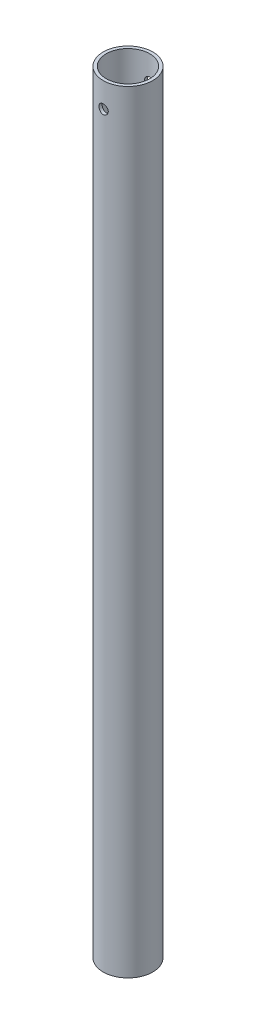
ISO-10303-21;
HEADER;
FILE_DESCRIPTION(('STEP AP214'),'2;1');
FILE_NAME('part.step','',(''),(''),'','','');
FILE_SCHEMA(('AUTOMOTIVE_DESIGN { 1 0 10303 214 1 1 1 1 }'));
ENDSEC;
DATA;
#1=APPLICATION_CONTEXT('core data for automotive mechanical design processes');
#2=APPLICATION_PROTOCOL_DEFINITION('international standard','automotive_design',2000,#1);
#3=PRODUCT_CONTEXT('',#1,'mechanical');
#4=PRODUCT('Part','Part','',(#3));
#5=PRODUCT_RELATED_PRODUCT_CATEGORY('part','',(#4));
#6=PRODUCT_DEFINITION_FORMATION('','',#4);
#7=PRODUCT_DEFINITION_CONTEXT('part definition',#1,'design');
#8=PRODUCT_DEFINITION('design','',#6,#7);
#9=PRODUCT_DEFINITION_SHAPE('','',#8);
#10=(LENGTH_UNIT() NAMED_UNIT(*) SI_UNIT(.MILLI.,.METRE.));
#11=(NAMED_UNIT(*) PLANE_ANGLE_UNIT() SI_UNIT($,.RADIAN.));
#12=(NAMED_UNIT(*) SI_UNIT($,.STERADIAN.) SOLID_ANGLE_UNIT());
#13=UNCERTAINTY_MEASURE_WITH_UNIT(LENGTH_MEASURE(1.E-05),#10,'distance_accuracy_value','');
#14=(GEOMETRIC_REPRESENTATION_CONTEXT(3) GLOBAL_UNCERTAINTY_ASSIGNED_CONTEXT((#13)) GLOBAL_UNIT_ASSIGNED_CONTEXT((#10,
#11,#12)) REPRESENTATION_CONTEXT('',''));
#15=CARTESIAN_POINT('',(0.,0.,0.));
#16=DIRECTION('',(0.,0.,1.));
#17=DIRECTION('',(1.,0.,0.));
#18=AXIS2_PLACEMENT_3D('',#15,#16,#17);
#19=CARTESIAN_POINT('',(0.,0.,0.));
#20=DIRECTION('',(0.,-1.,0.));
#21=DIRECTION('',(-1.,0.,0.));
#22=AXIS2_PLACEMENT_3D('',#19,#20,#21);
#23=PLANE('',#22);
#24=CARTESIAN_POINT('',(0.,0.,0.));
#25=DIRECTION('',(0.,1.,0.));
#26=DIRECTION('',(-1.,0.,0.));
#27=AXIS2_PLACEMENT_3D('',#24,#25,#26);
#28=CIRCLE('',#27,7.);
#29=CARTESIAN_POINT('',(-7.,0.,0.));
#30=VERTEX_POINT('',#29);
#31=EDGE_CURVE('E72',#30,#30,#28,.T.);
#32=ORIENTED_EDGE('',*,*,#31,.F.);
#33=EDGE_LOOP('',(#32));
#34=FACE_BOUND('',#33,.T.);
#35=CARTESIAN_POINT('',(0.,0.,0.));
#36=DIRECTION('',(0.,-1.,0.));
#37=DIRECTION('',(-1.,0.,0.));
#38=AXIS2_PLACEMENT_3D('',#35,#36,#37);
#39=CIRCLE('',#38,8.);
#40=CARTESIAN_POINT('',(-8.,0.,0.));
#41=VERTEX_POINT('',#40);
#42=EDGE_CURVE('E67',#41,#41,#39,.T.);
#43=ORIENTED_EDGE('',*,*,#42,.F.);
#44=EDGE_LOOP('',(#43));
#45=FACE_BOUND('',#44,.T.);
#46=ADVANCED_FACE('F47',(#34,#45),#23,.F.);
#47=CARTESIAN_POINT('',(0.,-8.,-8.));
#48=DIRECTION('',(0.,0.,1.));
#49=DIRECTION('',(-1.,0.,0.));
#50=AXIS2_PLACEMENT_3D('',#47,#48,#49);
#51=CYLINDRICAL_SURFACE('',#50,1.5);
#52=CARTESIAN_POINT('',(-1.49999999978405,-8.,6.8373971666677));
#53=CARTESIAN_POINT('',(-1.49999965088083,-7.95758300291167,6.83739727831568));
#54=CARTESIAN_POINT('',(-1.49583861521213,-7.85951434961256,6.8383115776398));
#55=CARTESIAN_POINT('',(-1.47202501497211,-7.69113646106586,6.84350580957671));
#56=CARTESIAN_POINT('',(-1.41806567354218,-7.49451520553893,6.85499259241314));
#57=CARTESIAN_POINT('',(-1.33105976834865,-7.29733264231131,6.87254404401072));
#58=CARTESIAN_POINT('',(-1.22608902308937,-7.12944876668352,6.89207465165844));
#59=CARTESIAN_POINT('',(-1.11611140159752,-6.9935426632106,6.9107374702972));
#60=CARTESIAN_POINT('',(-1.00563313796398,-6.88356772757888,6.92770460130483));
#61=CARTESIAN_POINT('',(-0.891894139107303,-6.79125323790794,6.94325970976453));
#62=CARTESIAN_POINT('',(-0.773494492140421,-6.71223863161666,6.95748631743976));
#63=CARTESIAN_POINT('',(-0.641526862707086,-6.64106542823196,6.97102724669318));
#64=CARTESIAN_POINT('',(-0.488379700294465,-6.57814084269406,6.98359817186479));
#65=CARTESIAN_POINT('',(-0.327882915155102,-6.53313494727356,6.99294865848775));
#66=CARTESIAN_POINT('',(-0.179737724638688,-6.50878548895904,6.99811824461622));
#67=CARTESIAN_POINT('',(-0.0591487473736199,-6.49990317159822,7.00002069945264));
#68=CARTESIAN_POINT('',(0.0432123882647992,-6.49963469197428,7.00007821865462));
#69=CARTESIAN_POINT('',(0.150199939214284,-6.50608468563577,6.99869666439857));
#70=CARTESIAN_POINT('',(0.279565653390642,-6.52377628010133,6.99492877992798));
#71=CARTESIAN_POINT('',(0.439442067228679,-6.56204534628418,6.98690990924433));
#72=CARTESIAN_POINT('',(0.604282463942989,-6.62311492818466,6.97452906365165));
#73=CARTESIAN_POINT('',(0.754948114702666,-6.7006867885716,6.95961094414882));
#74=CARTESIAN_POINT('',(0.879810682242643,-6.78242105012314,6.94480357758751));
#75=CARTESIAN_POINT('',(0.990779562948332,-6.87089074180731,6.92980122630359));
#76=CARTESIAN_POINT('',(1.09773714618158,-6.973836749225,6.91367269738519));
#77=CARTESIAN_POINT('',(1.20225640199746,-7.09763468848259,6.89624552264355));
#78=CARTESIAN_POINT('',(1.2982305568501,-7.24169708030179,6.87876011338582));
#79=CARTESIAN_POINT('',(1.37744732498567,-7.39767757406599,6.86325735702277));
#80=CARTESIAN_POINT('',(1.43982924917107,-7.56662557692498,6.85039110845123));
#81=CARTESIAN_POINT('',(1.48143010920784,-7.74174106132252,6.84146681413048));
#82=CARTESIAN_POINT('',(1.50102421553304,-7.91837308327269,6.83717260768776));
#83=CARTESIAN_POINT('',(1.50050172282816,-8.07573778048647,6.83728832011482));
#84=CARTESIAN_POINT('',(1.48595728616453,-8.21883276396663,6.84047166665416));
#85=CARTESIAN_POINT('',(1.4591461733891,-8.35798188237854,6.84626095736011));
#86=CARTESIAN_POINT('',(1.41496166975178,-8.50681949070405,6.85557500292349));
#87=CARTESIAN_POINT('',(1.35006282420459,-8.66123113464149,6.86871870938092));
#88=CARTESIAN_POINT('',(1.26682397710478,-8.8091306349981,6.88462302819184));
#89=CARTESIAN_POINT('',(1.16044129178898,-8.95650794418502,6.90347801319481));
#90=CARTESIAN_POINT('',(1.02174502569829,-9.10575080196659,6.92567985167008));
#91=CARTESIAN_POINT('',(0.845264676031658,-9.24656192906509,6.94970498725982));
#92=CARTESIAN_POINT('',(0.66031276877746,-9.35177309875295,6.96958060823681));
#93=CARTESIAN_POINT('',(0.492052345776781,-9.41990383752125,6.98321728910551));
#94=CARTESIAN_POINT('',(0.337659646143052,-9.46431330336543,6.99241044716765));
#95=CARTESIAN_POINT('',(0.172593454911886,-9.49358616791433,6.99861943610942));
#96=CARTESIAN_POINT('',(-0.0088053856347392,-9.50391774213455,7.00084271793348));
#97=CARTESIAN_POINT('',(-0.196799050061411,-9.49099423485626,6.99806392321082));
#98=CARTESIAN_POINT('',(-0.381429141348876,-9.45474201410665,6.99039177598325));
#99=CARTESIAN_POINT('',(-0.553292756936717,-9.39798581245149,6.9787513009727));
#100=CARTESIAN_POINT('',(-0.704650388882509,-9.32727200473699,6.96490343162665));
#101=CARTESIAN_POINT('',(-0.832857871187487,-9.25018704341948,6.95061012127447));
#102=CARTESIAN_POINT('',(-0.947623085875495,-9.1655942960193,6.93585483234584));
#103=CARTESIAN_POINT('',(-1.05887989582827,-9.06624883248964,6.91975498615173));
#104=CARTESIAN_POINT('',(-1.16830890923631,-8.94593723243016,6.90210484297714));
#105=CARTESIAN_POINT('',(-1.27012050622374,-8.8045956725059,6.88403458152637));
#106=CARTESIAN_POINT('',(-1.35597829249341,-8.64950979278484,6.86755676185175));
#107=CARTESIAN_POINT('',(-1.41967357910071,-8.49331660366793,6.8545939898807));
#108=CARTESIAN_POINT('',(-1.46149170003296,-8.34727685358758,6.84575634324438));
#109=CARTESIAN_POINT('',(-1.48537385058155,-8.2200166440675,6.84059616671284));
#110=CARTESIAN_POINT('',(-1.49750641609152,-8.10612597658501,6.83794494276427));
#111=CARTESIAN_POINT('',(-1.50000028845756,-8.03509472698334,6.83739707429305));
#112=CARTESIAN_POINT('',(-1.49999999978405,-8.,6.8373971666677));
#113=B_SPLINE_CURVE_WITH_KNOTS('',3,(#52,#53,#54,#55,#56,#57,#58,#59,#60,#61,#62,#63,#64,#65,
#66,#67,#68,#69,#70,#71,#72,#73,#74,#75,#76,#77,#78,#79,#80,#81,#82,#83,#84,#85,#86,#87,#88,#89,
#90,#91,#92,#93,#94,#95,#96,#97,#98,#99,#100,#101,#102,#103,#104,#105,#106,#107,#108,#109,#110,
#111,#112),.UNSPECIFIED.,.T.,.F.,(4,1,1,1,1,1,1,1,1,1,1,1,1,1,1,1,1,1,1,1,1,1,1,1,1,1,1,1,1,1,1,
1,1,1,1,1,1,1,1,1,1,1,1,1,1,1,1,1,1,1,1,1,1,1,1,1,1,1,4),(0.,0.0134672572514774,
0.0311271587279238,0.053900840402434,0.0781094053783975,0.0995562211168866,0.116907127848162,
0.133830339894763,0.149254613059719,0.163607370747915,0.179186474542146,0.196978025629642,
0.216222875732731,0.232070501358337,0.244594824798456,0.254568539180343,0.264537704776445,
0.278597881215563,0.295984870589466,0.316689659523063,0.334406735026791,0.34989199744326,
0.364230857525812,0.379654686049036,0.39723048651145,0.415872999616752,0.434777650280681,
0.452876431414163,0.473082018351963,0.491854977797718,0.50919405906431,0.522948429734579,
0.53746944543919,0.554156394585804,0.572241138658161,0.590708412000852,0.608163132807417,
0.630154379627723,0.655602042153704,0.679997780107422,0.697782066902748,0.713285156543704,
0.73100599461478,0.750936461373467,0.770834119556377,0.790693506495968,0.810579568085722,
0.828279545027644,0.843813384978189,0.858218385865703,0.873724791652635,0.89137269504939,
0.910060722395868,0.929209280821021,0.947777281089486,0.963662942571342,0.977442225381396,
0.98885753945592,1.),.UNSPECIFIED.);
#114=CARTESIAN_POINT('',(-1.49999999978405,-8.,6.8373971666677));
#115=VERTEX_POINT('',#114);
#116=EDGE_CURVE('E55',#115,#115,#113,.T.);
#117=ORIENTED_EDGE('',*,*,#116,.T.);
#118=EDGE_LOOP('',(#117));
#119=FACE_BOUND('',#118,.T.);
#120=CARTESIAN_POINT('',(-1.5,-8.,7.85811682275086));
#121=CARTESIAN_POINT('',(-1.50000007976886,-8.04581586641918,7.85811675265361));
#122=CARTESIAN_POINT('',(-1.49571219269731,-8.13933326621992,7.85893707925733));
#123=CARTESIAN_POINT('',(-1.47581642470767,-8.2811981789516,7.8627099547664));
#124=CARTESIAN_POINT('',(-1.44047005899305,-8.42779370265771,7.86928740460216));
#125=CARTESIAN_POINT('',(-1.38773428375331,-8.57710315821573,7.87880162702352));
#126=CARTESIAN_POINT('',(-1.31665262729626,-8.72498337537636,7.8910461609564));
#127=CARTESIAN_POINT('',(-1.22961681648028,-8.86425463367696,7.90512898695968));
#128=CARTESIAN_POINT('',(-1.11936730094601,-9.00418044807003,7.92161643711393));
#129=CARTESIAN_POINT('',(-0.975253617414165,-9.14699948843807,7.9409427365399));
#130=CARTESIAN_POINT('',(-0.792728169565887,-9.28063103506243,7.96147813046733));
#131=CARTESIAN_POINT('',(-0.603398154816423,-9.37812291303825,7.9779298300266));
#132=CARTESIAN_POINT('',(-0.434863682273135,-9.43831128877078,7.98862649812297));
#133=CARTESIAN_POINT('',(-0.294122464954987,-9.47289805237703,7.99494985346723));
#134=CARTESIAN_POINT('',(-0.167354225259256,-9.49232709897739,7.99856167497648));
#135=CARTESIAN_POINT('',(-0.0541387614648531,-9.50027773654676,8.00005208944975));
#136=CARTESIAN_POINT('',(0.0479945934774704,-9.50021989219026,8.00004113240019));
#137=CARTESIAN_POINT('',(0.155223652967982,-9.49341230014399,7.99876550013968));
#138=CARTESIAN_POINT('',(0.285055914911981,-9.47520049759668,7.99537333900153));
#139=CARTESIAN_POINT('',(0.445580162166911,-9.43609998626281,7.98821250708324));
#140=CARTESIAN_POINT('',(0.610726648440705,-9.374062728472,7.97723160990986));
#141=CARTESIAN_POINT('',(0.761391344165949,-9.29555572394061,7.96406785936412));
#142=CARTESIAN_POINT('',(0.886033631109959,-9.21306789201196,7.95105499765755));
#143=CARTESIAN_POINT('',(0.996773653516,-9.1238352952773,7.93789628027018));
#144=CARTESIAN_POINT('',(1.10346707897975,-9.02002293522417,7.92377518311917));
#145=CARTESIAN_POINT('',(1.20761211005704,-8.8952229922963,7.90855477795036));
#146=CARTESIAN_POINT('',(1.30250616246648,-8.75087099348748,7.89342208792096));
#147=CARTESIAN_POINT('',(1.37981353346111,-8.5965177758929,7.88020634786967));
#148=CARTESIAN_POINT('',(1.43549386703527,-8.44427830665322,7.87019937908033));
#149=CARTESIAN_POINT('',(1.47176180549148,-8.30065395638403,7.8634704849134));
#150=CARTESIAN_POINT('',(1.49241227418184,-8.16807067287519,7.85956527759116));
#151=CARTESIAN_POINT('',(1.50113306260714,-8.04118342049417,7.85790034838132));
#152=CARTESIAN_POINT('',(1.49938352317049,-7.91412975091455,7.85823508947037));
#153=CARTESIAN_POINT('',(1.48608180691086,-7.78091617289559,7.86076887715146));
#154=CARTESIAN_POINT('',(1.45791522044055,-7.63608464692425,7.86606172988731));
#155=CARTESIAN_POINT('',(1.41106203113403,-7.48183275460729,7.87464556992342));
#156=CARTESIAN_POINT('',(1.34303781260333,-7.32439854458976,7.88659318329427));
#157=CARTESIAN_POINT('',(1.25709991830501,-7.17577988872038,7.900803312234));
#158=CARTESIAN_POINT('',(1.14841002791346,-7.02903036026061,7.91744518348479));
#159=CARTESIAN_POINT('',(1.00733760432924,-6.88106705147626,7.93690722324279));
#160=CARTESIAN_POINT('',(0.828595946272862,-6.74227138920778,7.9577965791605));
#161=CARTESIAN_POINT('',(0.642000405444946,-6.63942629458106,7.97490021543001));
#162=CARTESIAN_POINT('',(0.473721676254657,-6.57393179424245,7.98642220694042));
#163=CARTESIAN_POINT('',(0.32082117458244,-6.53201790430344,7.99403609736071));
#164=CARTESIAN_POINT('',(0.168929386529988,-6.50670904960804,7.9987397395597));
#165=CARTESIAN_POINT('',(0.0210328851438523,-6.4979675514501,8.0003818777262));
#166=CARTESIAN_POINT('',(-0.115171602271736,-6.50262130480757,7.99950737911522));
#167=CARTESIAN_POINT('',(-0.252636709957332,-6.51905847410635,7.99643847175343));
#168=CARTESIAN_POINT('',(-0.409462478843972,-6.55337941676859,7.99012154605848));
#169=CARTESIAN_POINT('',(-0.573276399318363,-6.6099971438062,7.98000950115333));
#170=CARTESIAN_POINT('',(-0.724742903613062,-6.68358961911274,7.9674991758789));
#171=CARTESIAN_POINT('',(-0.851707705141217,-6.76258745703492,7.95481631277721));
#172=CARTESIAN_POINT('',(-0.96495900421505,-6.84872916905219,7.94183820948284));
#173=CARTESIAN_POINT('',(-1.07456739086848,-6.94957182351586,7.9277606107351));
#174=CARTESIAN_POINT('',(-1.18220142063406,-7.07147478297519,7.91241017967009));
#175=CARTESIAN_POINT('',(-1.28198442811542,-7.21442831125975,7.89680257896434));
#176=CARTESIAN_POINT('',(-1.365512240946,-7.37079471655028,7.88271797153561));
#177=CARTESIAN_POINT('',(-1.42841030401049,-7.53185643094723,7.87150293612322));
#178=CARTESIAN_POINT('',(-1.47082231722788,-7.69140884151368,7.86365264128744));
#179=CARTESIAN_POINT('',(-1.49481561124054,-7.84683377930021,7.8591089800199));
#180=CARTESIAN_POINT('',(-1.49999991225059,-7.94960043749882,7.85811689986105));
#181=CARTESIAN_POINT('',(-1.5,-8.,7.85811682275086));
#182=B_SPLINE_CURVE_WITH_KNOTS('',3,(#120,#121,#122,#123,#124,#125,#126,#127,#128,#129,#130,
#131,#132,#133,#134,#135,#136,#137,#138,#139,#140,#141,#142,#143,#144,#145,#146,#147,#148,#149,
#150,#151,#152,#153,#154,#155,#156,#157,#158,#159,#160,#161,#162,#163,#164,#165,#166,#167,#168,
#169,#170,#171,#172,#173,#174,#175,#176,#177,#178,#179,#180,#181),.UNSPECIFIED.,.T.,.F.,(4,1,1,
1,1,1,1,1,1,1,1,1,1,1,1,1,1,1,1,1,1,1,1,1,1,1,1,1,1,1,1,1,1,1,1,1,1,1,1,1,1,1,1,1,1,1,1,1,1,1,1,
1,1,1,1,1,1,1,1,4),(0.,0.0145525176358879,0.0297025243562516,0.045458692922738,
0.0624297573647699,0.0800099840588011,0.0976363019078882,0.114700127167349,0.136750193716104,
0.162214633096385,0.186613305512082,0.204387120944041,0.219061367847867,0.232635670042819,
0.245097383794799,0.255078488713282,0.265053979906421,0.279207342995098,0.296689329139464,
0.317491729169335,0.335223016449891,0.350723965291009,0.365085684403936,0.380538796770174,
0.398160571650345,0.416859121803383,0.435517016471511,0.453056356644806,0.468364119862753,
0.482558284277219,0.495643737061803,0.508724056013569,0.522881127476504,0.538129530312189,
0.555556773691615,0.574072059044357,0.59263982095549,0.610173707614324,0.63222603645446,
0.657708477379371,0.682125133817763,0.699912847223262,0.715082563620866,0.732476834631965,
0.74876730943145,0.762068136194739,0.77572308228957,0.792708276265361,0.813015459709881,
0.830749511811104,0.846254531849407,0.860622222568915,0.876082558749603,0.893713746914056,
0.912422865934731,0.931576079890244,0.950094969682512,0.967356411934369,0.983991560577968,1.),.UNSPECIFIED.);
#183=CARTESIAN_POINT('',(-1.5,-8.,7.85811682275086));
#184=VERTEX_POINT('',#183);
#185=EDGE_CURVE('E10',#184,#184,#182,.T.);
#186=ORIENTED_EDGE('',*,*,#185,.T.);
#187=EDGE_LOOP('',(#186));
#188=FACE_BOUND('',#187,.T.);
#189=ADVANCED_FACE('F126',(#119,#188),#51,.F.);
#190=CARTESIAN_POINT('',(-1.5,-8.,-7.85811682275086));
#191=CARTESIAN_POINT('',(-1.50000007976886,-7.95418413358085,-7.85811675265361));
#192=CARTESIAN_POINT('',(-1.49571219269731,-7.86066673378008,-7.85893707925733));
#193=CARTESIAN_POINT('',(-1.47581642470763,-7.71880182104819,-7.86270995476641));
#194=CARTESIAN_POINT('',(-1.44047005899312,-7.57220629734263,-7.86928740460214));
#195=CARTESIAN_POINT('',(-1.38773428375375,-7.42289684178527,-7.87880162702345));
#196=CARTESIAN_POINT('',(-1.31665262729546,-7.27501662462203,-7.89104616095653));
#197=CARTESIAN_POINT('',(-1.22961681647756,-7.1357453663189,-7.90512898696015));
#198=CARTESIAN_POINT('',(-1.11936730095641,-6.99581955194516,-7.92161643711213));
#199=CARTESIAN_POINT('',(-0.975253617425675,-6.85300051155916,-7.94094273653984));
#200=CARTESIAN_POINT('',(-0.792728169404135,-6.71936896485304,-7.96147813048133));
#201=CARTESIAN_POINT('',(-0.603398155109725,-6.62187708708653,-7.97792983000495));
#202=CARTESIAN_POINT('',(-0.434863681911152,-6.56168871109294,-7.98862649814723));
#203=CARTESIAN_POINT('',(-0.294122464332461,-6.52710194752281,-7.99494985348584));
#204=CARTESIAN_POINT('',(-0.167354225406413,-6.50767290101465,-7.99856167497791));
#205=CARTESIAN_POINT('',(-0.054138760244835,-6.49972226337231,-8.00005208946494));
#206=CARTESIAN_POINT('',(0.0479945955942712,-6.49978010790437,-8.00004113238242));
#207=CARTESIAN_POINT('',(0.155223653376668,-6.50658769993601,-7.99876550012485));
#208=CARTESIAN_POINT('',(0.285055913806494,-6.52479950218316,-7.99537333904205));
#209=CARTESIAN_POINT('',(0.445580162786216,-6.56390001389358,-7.98821250705489));
#210=CARTESIAN_POINT('',(0.610726648405003,-6.62593727153999,-7.97723160990815));
#211=CARTESIAN_POINT('',(0.761391344170226,-6.70444427605368,-7.96406785936495));
#212=CARTESIAN_POINT('',(0.886033631118924,-6.78693210799683,-7.95105499765623));
#213=CARTESIAN_POINT('',(0.9967736535117,-6.87616470471861,-7.93789628027078));
#214=CARTESIAN_POINT('',(1.10346707897786,-6.97997706477368,-7.92377518311942));
#215=CARTESIAN_POINT('',(1.20761211005752,-7.10477700770426,-7.9085547779503));
#216=CARTESIAN_POINT('',(1.30250616246658,-7.24912900651276,-7.89342208792093));
#217=CARTESIAN_POINT('',(1.37981353346102,-7.40348222410689,-7.88020634786968));
#218=CARTESIAN_POINT('',(1.43549386703527,-7.55572169334675,-7.87019937908033));
#219=CARTESIAN_POINT('',(1.47176180549147,-7.69934604361595,-7.8634704849134));
#220=CARTESIAN_POINT('',(1.49241227418185,-7.83192932712485,-7.85956527759117));
#221=CARTESIAN_POINT('',(1.50113306260715,-7.95881657950609,-7.85790034838131));
#222=CARTESIAN_POINT('',(1.49938352317049,-8.08587024908497,-7.85823508947038));
#223=CARTESIAN_POINT('',(1.48608180691112,-8.21908382710269,-7.86076887715141));
#224=CARTESIAN_POINT('',(1.45791522043989,-8.36391535307956,-7.86606172988744));
#225=CARTESIAN_POINT('',(1.41106203112997,-8.51816724540321,-7.87464556992412));
#226=CARTESIAN_POINT('',(1.34303781261052,-8.67560145539357,-7.8865931832931));
#227=CARTESIAN_POINT('',(1.25709991833207,-8.82422011123646,-7.90080331222925));
#228=CARTESIAN_POINT('',(1.14841002780848,-8.97096963989843,-7.91744518350289));
#229=CARTESIAN_POINT('',(1.00733760423679,-9.11893294848988,-7.93690722324294));
#230=CARTESIAN_POINT('',(0.828595947839308,-9.25772860987722,-7.9577965790123));
#231=CARTESIAN_POINT('',(0.642000403252454,-9.36057370644332,-7.97490021560553));
#232=CARTESIAN_POINT('',(0.473721678864006,-9.42606820465823,-7.98642220674615));
#233=CARTESIAN_POINT('',(0.320821177929007,-9.46798209535743,-7.99403609729665));
#234=CARTESIAN_POINT('',(0.168929385437134,-9.49329094962986,-7.99873973941834));
#235=CARTESIAN_POINT('',(0.0210329102559286,-9.5020324479172,-8.00038187760796));
#236=CARTESIAN_POINT('',(-0.115171586939067,-9.49737869727647,-7.99950737950404));
#237=CARTESIAN_POINT('',(-0.252636719121736,-9.4809415242877,-7.99643847145655));
#238=CARTESIAN_POINT('',(-0.409462473386162,-9.44662058448309,-7.99012154628662));
#239=CARTESIAN_POINT('',(-0.573276399721832,-9.39000285626646,-7.98000950116345));
#240=CARTESIAN_POINT('',(-0.724742903579738,-9.3164103808326,-7.96749917587068));
#241=CARTESIAN_POINT('',(-0.851707705069645,-9.2374125430344,-7.95481631278781));
#242=CARTESIAN_POINT('',(-0.964959004255288,-9.15127083091143,-7.9418382094774));
#243=CARTESIAN_POINT('',(-1.07456739089155,-9.05042817646001,-7.92776061073204));
#244=CARTESIAN_POINT('',(-1.18220142063776,-8.92852521701898,-7.91241017966945));
#245=CARTESIAN_POINT('',(-1.2819844281167,-8.78557168873821,-7.89680257896415));
#246=CARTESIAN_POINT('',(-1.36551224094607,-8.62920528344943,-7.88271797153559));
#247=CARTESIAN_POINT('',(-1.42841030401035,-8.46814356905323,-7.87150293612325));
#248=CARTESIAN_POINT('',(-1.47082231722792,-8.30859115848619,-7.86365264128744));
#249=CARTESIAN_POINT('',(-1.49481561124055,-8.15316622069961,-7.8591089800199));
#250=CARTESIAN_POINT('',(-1.49999991225059,-8.05039956250119,-7.85811689986105));
#251=CARTESIAN_POINT('',(-1.5,-8.,-7.85811682275086));
#252=B_SPLINE_CURVE_WITH_KNOTS('',3,(#190,#191,#192,#193,#194,#195,#196,#197,#198,#199,#200,
#201,#202,#203,#204,#205,#206,#207,#208,#209,#210,#211,#212,#213,#214,#215,#216,#217,#218,#219,
#220,#221,#222,#223,#224,#225,#226,#227,#228,#229,#230,#231,#232,#233,#234,#235,#236,#237,#238,
#239,#240,#241,#242,#243,#244,#245,#246,#247,#248,#249,#250,#251),.UNSPECIFIED.,.T.,.F.,(4,1,1,
1,1,1,1,1,1,1,1,1,1,1,1,1,1,1,1,1,1,1,1,1,1,1,1,1,1,1,1,1,1,1,1,1,1,1,1,1,1,1,1,1,1,1,1,1,1,1,1,
1,1,1,1,1,1,1,1,4),(0.,0.0145525176358869,0.0297025243562519,0.0454586929227751,
0.0624297573647651,0.0800099840585644,0.0976363019078401,0.114700127168234,0.136750193714012,
0.162214633095995,0.186613305529011,0.20438712092842,0.219061367883204,0.232635670158599,
0.245097384027334,0.255078488657447,0.265053979826389,0.279207343066828,0.296689329155726,
0.317491729169335,0.335223016450463,0.350723965289843,0.365085684403705,0.380538796770281,
0.398160571650306,0.416859121803335,0.435517016471509,0.453056356644811,0.468364119862754,
0.482558284277211,0.495643737061803,0.508724056013619,0.522881127476487,0.538129530311809,
0.555556773691719,0.57407205904694,0.592639820956245,0.61017370760586,0.632226036476921,
0.657708477378968,0.682125133631254,0.699912847271416,0.715082563372613,0.732476834115379,
0.748767306726754,0.762068136808243,0.775723081680526,0.792708276139075,0.813015459709845,
0.830749511806351,0.846254531862459,0.860622222575249,0.876082558751601,0.893713746914752,
0.912422865934742,0.931576079890241,0.95009496968255,0.967356411934369,0.983991560577951,1.),.UNSPECIFIED.);
#253=CARTESIAN_POINT('',(-1.5,-8.,-7.85811682275086));
#254=VERTEX_POINT('',#253);
#255=EDGE_CURVE('E56',#254,#254,#252,.T.);
#256=ORIENTED_EDGE('',*,*,#255,.T.);
#257=EDGE_LOOP('',(#256));
#258=FACE_BOUND('',#257,.T.);
#259=CARTESIAN_POINT('',(-1.49999999978405,-8.,-6.8373971666677));
#260=CARTESIAN_POINT('',(-1.49999965088083,-8.04241699708833,-6.83739727831568));
#261=CARTESIAN_POINT('',(-1.49583861521213,-8.14048565038744,-6.83831157763981));
#262=CARTESIAN_POINT('',(-1.47202501497211,-8.30886353893414,-6.84350580957671));
#263=CARTESIAN_POINT('',(-1.41806567354218,-8.50548479446108,-6.85499259241315));
#264=CARTESIAN_POINT('',(-1.33105976834865,-8.70266735768869,-6.87254404401072));
#265=CARTESIAN_POINT('',(-1.22608902308937,-8.87055123331648,-6.89207465165844));
#266=CARTESIAN_POINT('',(-1.11611140159753,-9.00645733678941,-6.9107374702972));
#267=CARTESIAN_POINT('',(-1.00563313796398,-9.11643227242112,-6.92770460130483));
#268=CARTESIAN_POINT('',(-0.891894139107298,-9.20874676209206,-6.94325970976453));
#269=CARTESIAN_POINT('',(-0.77349449214042,-9.28776136838335,-6.95748631743976));
#270=CARTESIAN_POINT('',(-0.641526862707081,-9.35893457176804,-6.97102724669318));
#271=CARTESIAN_POINT('',(-0.488379700294465,-9.42185915730593,-6.98359817186479));
#272=CARTESIAN_POINT('',(-0.327882915155101,-9.46686505272643,-6.99294865848775));
#273=CARTESIAN_POINT('',(-0.179737724638689,-9.49121451104096,-6.99811824461622));
#274=CARTESIAN_POINT('',(-0.0591487473736187,-9.50009682840178,-7.00002069945264));
#275=CARTESIAN_POINT('',(0.0432123882648006,-9.50036530802572,-7.00007821865462));
#276=CARTESIAN_POINT('',(0.150199939214284,-9.49391531436423,-6.99869666439857));
#277=CARTESIAN_POINT('',(0.27956565339064,-9.47622371989867,-6.99492877992798));
#278=CARTESIAN_POINT('',(0.43944206722868,-9.43795465371582,-6.98690990924433));
#279=CARTESIAN_POINT('',(0.60428246394299,-9.37688507181534,-6.97452906365165));
#280=CARTESIAN_POINT('',(0.754948114702666,-9.2993132114284,-6.95961094414882));
#281=CARTESIAN_POINT('',(0.879810682242644,-9.21757894987686,-6.94480357758751));
#282=CARTESIAN_POINT('',(0.990779562948332,-9.12910925819268,-6.92980122630359));
#283=CARTESIAN_POINT('',(1.09773714618158,-9.026163250775,-6.91367269738519));
#284=CARTESIAN_POINT('',(1.20225640199746,-8.90236531151742,-6.89624552264355));
#285=CARTESIAN_POINT('',(1.2982305568501,-8.75830291969822,-6.87876011338582));
#286=CARTESIAN_POINT('',(1.37744732498567,-8.60232242593401,-6.86325735702277));
#287=CARTESIAN_POINT('',(1.43982924917107,-8.43337442307502,-6.85039110845123));
#288=CARTESIAN_POINT('',(1.48143010920784,-8.25825893867748,-6.84146681413048));
#289=CARTESIAN_POINT('',(1.50102421553304,-8.08162691672732,-6.83717260768775));
#290=CARTESIAN_POINT('',(1.50050172282816,-7.92426221951353,-6.83728832011482));
#291=CARTESIAN_POINT('',(1.48595728616453,-7.78116723603337,-6.84047166665416));
#292=CARTESIAN_POINT('',(1.4591461733891,-7.64201811762146,-6.8462609573601));
#293=CARTESIAN_POINT('',(1.41496166975179,-7.49318050929595,-6.85557500292349));
#294=CARTESIAN_POINT('',(1.35006282420459,-7.33876886535851,-6.86871870938092));
#295=CARTESIAN_POINT('',(1.26682397710478,-7.1908693650019,-6.88462302819183));
#296=CARTESIAN_POINT('',(1.16044129178897,-7.04349205581497,-6.90347801319481));
#297=CARTESIAN_POINT('',(1.02174502569829,-6.89424919803341,-6.92567985167008));
#298=CARTESIAN_POINT('',(0.845264676031654,-6.75343807093491,-6.94970498725982));
#299=CARTESIAN_POINT('',(0.660312768777461,-6.64822690124705,-6.96958060823681));
#300=CARTESIAN_POINT('',(0.492052345776779,-6.58009616247875,-6.98321728910551));
#301=CARTESIAN_POINT('',(0.337659646143053,-6.53568669663457,-6.99241044716765));
#302=CARTESIAN_POINT('',(0.172593454911883,-6.50641383208568,-6.99861943610942));
#303=CARTESIAN_POINT('',(-0.00880538563473868,-6.49608225786544,-7.00084271793347));
#304=CARTESIAN_POINT('',(-0.196799050061408,-6.50900576514375,-6.99806392321082));
#305=CARTESIAN_POINT('',(-0.381429141348874,-6.54525798589334,-6.99039177598325));
#306=CARTESIAN_POINT('',(-0.553292756936709,-6.6020141875485,-6.9787513009727));
#307=CARTESIAN_POINT('',(-0.7046503888825,-6.67272799526301,-6.96490343162665));
#308=CARTESIAN_POINT('',(-0.832857871187482,-6.74981295658051,-6.95061012127446));
#309=CARTESIAN_POINT('',(-0.947623085875487,-6.83440570398069,-6.93585483234584));
#310=CARTESIAN_POINT('',(-1.05887989582826,-6.93375116751036,-6.91975498615173));
#311=CARTESIAN_POINT('',(-1.16830890923631,-7.05406276756985,-6.90210484297715));
#312=CARTESIAN_POINT('',(-1.27012050622374,-7.1954043274941,-6.88403458152637));
#313=CARTESIAN_POINT('',(-1.35597829249341,-7.35049020721515,-6.86755676185176));
#314=CARTESIAN_POINT('',(-1.4196735791007,-7.50668339633207,-6.85459398988069));
#315=CARTESIAN_POINT('',(-1.46149170003296,-7.65272314641241,-6.84575634324439));
#316=CARTESIAN_POINT('',(-1.48537385058154,-7.7799833559325,-6.84059616671283));
#317=CARTESIAN_POINT('',(-1.49750641609152,-7.89387402341498,-6.83794494276428));
#318=CARTESIAN_POINT('',(-1.50000028845756,-7.96490527301666,-6.83739707429305));
#319=CARTESIAN_POINT('',(-1.49999999978405,-8.,-6.8373971666677));
#320=B_SPLINE_CURVE_WITH_KNOTS('',3,(#259,#260,#261,#262,#263,#264,#265,#266,#267,#268,#269,
#270,#271,#272,#273,#274,#275,#276,#277,#278,#279,#280,#281,#282,#283,#284,#285,#286,#287,#288,
#289,#290,#291,#292,#293,#294,#295,#296,#297,#298,#299,#300,#301,#302,#303,#304,#305,#306,#307,
#308,#309,#310,#311,#312,#313,#314,#315,#316,#317,#318,#319),.UNSPECIFIED.,.T.,.F.,(4,1,1,1,1,1,
1,1,1,1,1,1,1,1,1,1,1,1,1,1,1,1,1,1,1,1,1,1,1,1,1,1,1,1,1,1,1,1,1,1,1,1,1,1,1,1,1,1,1,1,1,1,1,1,
1,1,1,1,4),(0.,0.0134672572514781,0.0311271587279247,0.0539008404024342,0.0781094053783978,
0.0995562211168869,0.116907127848162,0.133830339894764,0.149254613059719,0.163607370747916,
0.179186474542147,0.196978025629642,0.21622287573273,0.232070501358337,0.244594824798456,
0.254568539180343,0.264537704776445,0.278597881215563,0.295984870589466,0.316689659523063,
0.334406735026791,0.34989199744326,0.364230857525812,0.379654686049036,0.39723048651145,
0.415872999616753,0.434777650280681,0.452876431414163,0.473082018351963,0.491854977797718,
0.509194059064309,0.522948429734579,0.53746944543919,0.554156394585804,0.572241138658162,
0.590708412000853,0.608163132807417,0.630154379627724,0.655602042153705,0.679997780107423,
0.697782066902749,0.713285156543704,0.73100599461478,0.750936461373468,0.770834119556377,
0.790693506495968,0.810579568085721,0.828279545027644,0.843813384978189,0.858218385865702,
0.873724791652635,0.89137269504939,0.910060722395869,0.929209280821021,0.947777281089486,
0.963662942571342,0.977442225381396,0.98885753945592,1.),.UNSPECIFIED.);
#321=CARTESIAN_POINT('',(-1.49999999978405,-8.,-6.8373971666677));
#322=VERTEX_POINT('',#321);
#323=EDGE_CURVE('E76',#322,#322,#320,.T.);
#324=ORIENTED_EDGE('',*,*,#323,.T.);
#325=EDGE_LOOP('',(#324));
#326=FACE_BOUND('',#325,.T.);
#327=ADVANCED_FACE('F132',(#258,#326),#51,.F.);
#328=CARTESIAN_POINT('',(0.,0.,0.));
#329=DIRECTION('',(0.,-1.,0.));
#330=DIRECTION('',(-1.,0.,0.));
#331=AXIS2_PLACEMENT_3D('',#328,#329,#330);
#332=CYLINDRICAL_SURFACE('',#331,8.);
#333=ORIENTED_EDGE('',*,*,#185,.F.);
#334=EDGE_LOOP('',(#333));
#335=FACE_BOUND('',#334,.T.);
#336=ORIENTED_EDGE('',*,*,#255,.F.);
#337=EDGE_LOOP('',(#336));
#338=FACE_BOUND('',#337,.T.);
#339=ORIENTED_EDGE('',*,*,#42,.T.);
#340=EDGE_LOOP('',(#339));
#341=FACE_BOUND('',#340,.T.);
#342=CARTESIAN_POINT('',(0.,-249.,0.));
#343=DIRECTION('',(0.,-1.,0.));
#344=DIRECTION('',(0.,0.,-1.));
#345=AXIS2_PLACEMENT_3D('',#342,#343,#344);
#346=CIRCLE('',#345,8.);
#347=CARTESIAN_POINT('',(0.,-249.,-8.));
#348=VERTEX_POINT('',#347);
#349=EDGE_CURVE('E102',#348,#348,#346,.T.);
#350=ORIENTED_EDGE('',*,*,#349,.F.);
#351=EDGE_LOOP('',(#350));
#352=FACE_BOUND('',#351,.T.);
#353=ADVANCED_FACE('F125',(#335,#338,#341,#352),#332,.T.);
#354=CARTESIAN_POINT('',(0.,0.,0.));
#355=DIRECTION('',(0.,1.,0.));
#356=DIRECTION('',(-1.,0.,0.));
#357=AXIS2_PLACEMENT_3D('',#354,#355,#356);
#358=CYLINDRICAL_SURFACE('',#357,7.);
#359=ORIENTED_EDGE('',*,*,#323,.F.);
#360=EDGE_LOOP('',(#359));
#361=FACE_BOUND('',#360,.T.);
#362=ORIENTED_EDGE('',*,*,#116,.F.);
#363=EDGE_LOOP('',(#362));
#364=FACE_BOUND('',#363,.T.);
#365=ORIENTED_EDGE('',*,*,#31,.T.);
#366=EDGE_LOOP('',(#365));
#367=FACE_BOUND('',#366,.T.);
#368=CARTESIAN_POINT('',(0.,-249.,0.));
#369=DIRECTION('',(0.,-1.,0.));
#370=DIRECTION('',(0.,0.,-1.));
#371=AXIS2_PLACEMENT_3D('',#368,#369,#370);
#372=CIRCLE('',#371,7.);
#373=CARTESIAN_POINT('',(0.,-249.,-7.));
#374=VERTEX_POINT('',#373);
#375=EDGE_CURVE('E110',#374,#374,#372,.T.);
#376=ORIENTED_EDGE('',*,*,#375,.T.);
#377=EDGE_LOOP('',(#376));
#378=FACE_BOUND('',#377,.T.);
#379=ADVANCED_FACE('F117',(#361,#364,#367,#378),#358,.F.);
#380=CARTESIAN_POINT('',(0.,-249.,0.));
#381=DIRECTION('',(0.,-1.,0.));
#382=DIRECTION('',(0.,0.,-1.));
#383=AXIS2_PLACEMENT_3D('',#380,#381,#382);
#384=PLANE('',#383);
#385=ORIENTED_EDGE('',*,*,#349,.T.);
#386=EDGE_LOOP('',(#385));
#387=FACE_BOUND('',#386,.T.);
#388=ORIENTED_EDGE('',*,*,#375,.F.);
#389=EDGE_LOOP('',(#388));
#390=FACE_BOUND('',#389,.T.);
#391=ADVANCED_FACE('F118',(#387,#390),#384,.T.);
#392=CLOSED_SHELL('',(#46,#189,#327,#353,#379,#391));
#393=MANIFOLD_SOLID_BREP('B2',#392);
#394=ADVANCED_BREP_SHAPE_REPRESENTATION('',(#18,#393),#14);
#395=SHAPE_DEFINITION_REPRESENTATION(#9,#394);
ENDSEC;
END-ISO-10303-21;
